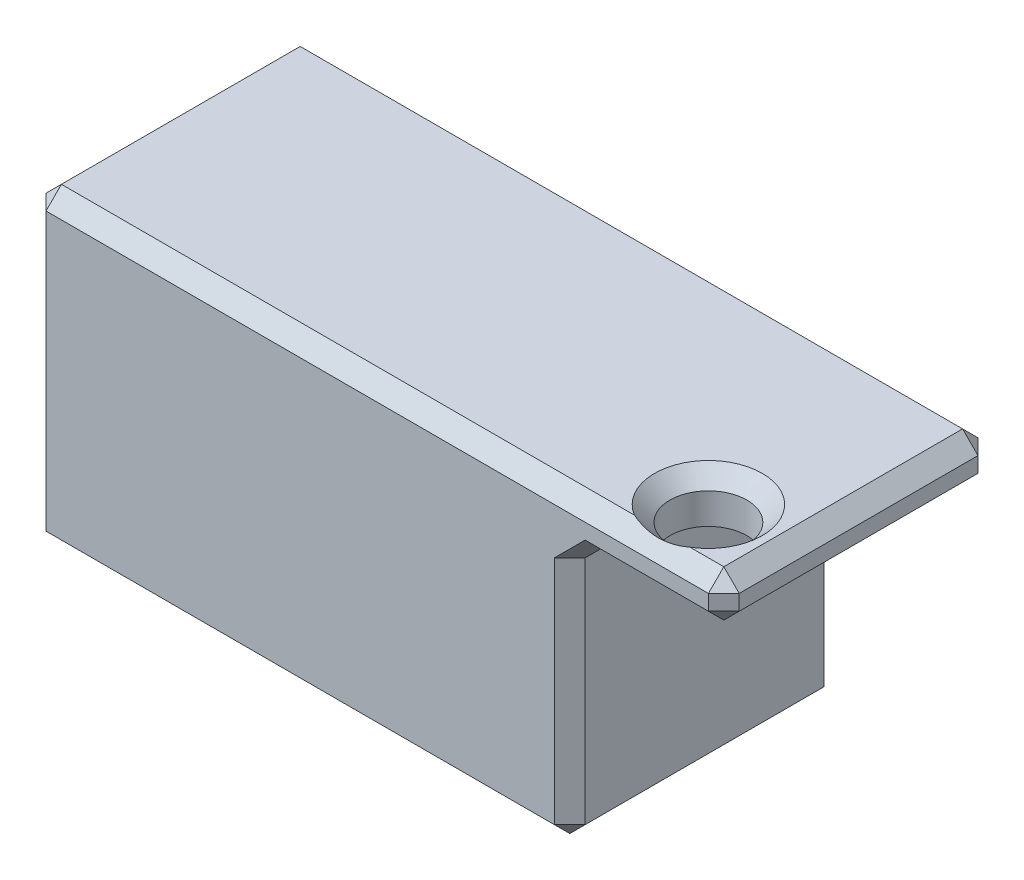
ISO-10303-21;
HEADER;
FILE_DESCRIPTION(('STEP AP214'),'2;1');
FILE_NAME('part.step','',(''),(''),'','','');
FILE_SCHEMA(('AUTOMOTIVE_DESIGN { 1 0 10303 214 1 1 1 1 }'));
ENDSEC;
DATA;
#1=APPLICATION_CONTEXT('core data for automotive mechanical design processes');
#2=APPLICATION_PROTOCOL_DEFINITION('international standard','automotive_design',2000,#1);
#3=PRODUCT_CONTEXT('',#1,'mechanical');
#4=PRODUCT('Part','Part','',(#3));
#5=PRODUCT_RELATED_PRODUCT_CATEGORY('part','',(#4));
#6=PRODUCT_DEFINITION_FORMATION('','',#4);
#7=PRODUCT_DEFINITION_CONTEXT('part definition',#1,'design');
#8=PRODUCT_DEFINITION('design','',#6,#7);
#9=PRODUCT_DEFINITION_SHAPE('','',#8);
#10=(LENGTH_UNIT() NAMED_UNIT(*) SI_UNIT(.MILLI.,.METRE.));
#11=(NAMED_UNIT(*) PLANE_ANGLE_UNIT() SI_UNIT($,.RADIAN.));
#12=(NAMED_UNIT(*) SI_UNIT($,.STERADIAN.) SOLID_ANGLE_UNIT());
#13=UNCERTAINTY_MEASURE_WITH_UNIT(LENGTH_MEASURE(1.E-05),#10,'distance_accuracy_value','');
#14=(GEOMETRIC_REPRESENTATION_CONTEXT(3) GLOBAL_UNCERTAINTY_ASSIGNED_CONTEXT((#13)) GLOBAL_UNIT_ASSIGNED_CONTEXT((#10,
#11,#12)) REPRESENTATION_CONTEXT('',''));
#15=CARTESIAN_POINT('',(0.,0.,0.));
#16=DIRECTION('',(0.,0.,1.));
#17=DIRECTION('',(1.,0.,0.));
#18=AXIS2_PLACEMENT_3D('',#15,#16,#17);
#19=CARTESIAN_POINT('',(0.,0.,-9.5));
#20=DIRECTION('',(0.,0.,-1.));
#21=DIRECTION('',(-1.,0.,0.));
#22=AXIS2_PLACEMENT_3D('',#19,#20,#21);
#23=PLANE('',#22);
#24=DIRECTION('',(0.70710678118655,0.707106781186545,0.));
#25=VECTOR('',#24,1.);
#26=CARTESIAN_POINT('',(8.99999999999988,-8.99999999999994,-9.5));
#27=LINE('',#26,#25);
#28=CARTESIAN_POINT('',(35.,17.,-9.5));
#29=VERTEX_POINT('',#28);
#30=CARTESIAN_POINT('',(36.,18.,-9.5));
#31=VERTEX_POINT('',#30);
#32=EDGE_CURVE('E188',#29,#31,#27,.T.);
#33=ORIENTED_EDGE('',*,*,#32,.F.);
#34=DIRECTION('',(0.70710678118655,0.707106781186545,0.));
#35=VECTOR('',#34,1.);
#36=CARTESIAN_POINT('',(8.99999999999988,-8.99999999999994,-9.5));
#37=LINE('',#36,#35);
#38=CARTESIAN_POINT('',(34.,16.,-9.5));
#39=VERTEX_POINT('',#38);
#40=EDGE_CURVE('E190',#39,#29,#37,.T.);
#41=ORIENTED_EDGE('',*,*,#40,.F.);
#42=DIRECTION('',(0.,-1.,0.));
#43=VECTOR('',#42,1.);
#44=CARTESIAN_POINT('',(34.,0.,-9.5));
#45=LINE('',#44,#43);
#46=CARTESIAN_POINT('',(34.,1.00000000000001,-9.5));
#47=VERTEX_POINT('',#46);
#48=EDGE_CURVE('E203',#39,#47,#45,.T.);
#49=ORIENTED_EDGE('',*,*,#48,.T.);
#50=DIRECTION('',(-1.,0.,0.));
#51=VECTOR('',#50,1.);
#52=CARTESIAN_POINT('',(0.,1.00000000000001,-9.5));
#53=LINE('',#52,#51);
#54=CARTESIAN_POINT('',(1.00000000000001,1.00000000000001,-9.5));
#55=VERTEX_POINT('',#54);
#56=EDGE_CURVE('E206',#47,#55,#53,.T.);
#57=ORIENTED_EDGE('',*,*,#56,.T.);
#58=DIRECTION('',(0.,1.,0.));
#59=VECTOR('',#58,1.);
#60=CARTESIAN_POINT('',(1.00000000000001,20.,-9.5));
#61=LINE('',#60,#59);
#62=CARTESIAN_POINT('',(1.00000000000001,19.,-9.5));
#63=VERTEX_POINT('',#62);
#64=EDGE_CURVE('E586',#55,#63,#61,.T.);
#65=ORIENTED_EDGE('',*,*,#64,.T.);
#66=DIRECTION('',(1.,0.,0.));
#67=VECTOR('',#66,1.);
#68=CARTESIAN_POINT('',(0.,19.,-9.5));
#69=LINE('',#68,#67);
#70=CARTESIAN_POINT('',(44.,19.,-9.5));
#71=VERTEX_POINT('',#70);
#72=EDGE_CURVE('E584',#63,#71,#69,.T.);
#73=ORIENTED_EDGE('',*,*,#72,.T.);
#74=DIRECTION('',(0.,-1.,0.));
#75=VECTOR('',#74,1.);
#76=CARTESIAN_POINT('',(44.,0.,-9.5));
#77=LINE('',#76,#75);
#78=CARTESIAN_POINT('',(44.,18.,-9.5));
#79=VERTEX_POINT('',#78);
#80=EDGE_CURVE('E582',#71,#79,#77,.T.);
#81=ORIENTED_EDGE('',*,*,#80,.T.);
#82=DIRECTION('',(-1.,0.,0.));
#83=VECTOR('',#82,1.);
#84=CARTESIAN_POINT('',(35.,18.,-9.5));
#85=LINE('',#84,#83);
#86=EDGE_CURVE('E193',#79,#31,#85,.T.);
#87=ORIENTED_EDGE('',*,*,#86,.T.);
#88=EDGE_LOOP('',(#33,#41,#49,#57,#65,#73,#81,#87));
#89=FACE_BOUND('',#88,.T.);
#90=ADVANCED_FACE('F43',(#89),#23,.T.);
#91=CARTESIAN_POINT('',(0.,20.,0.));
#92=DIRECTION('',(1.,0.,0.));
#93=DIRECTION('',(0.,0.,-1.));
#94=AXIS2_PLACEMENT_3D('',#91,#92,#93);
#95=PLANE('',#94);
#96=DIRECTION('',(0.,0.,-1.));
#97=VECTOR('',#96,1.);
#98=CARTESIAN_POINT('',(0.,19.,-9.5));
#99=LINE('',#98,#97);
#100=CARTESIAN_POINT('',(0.,19.,6.99999999999999));
#101=VERTEX_POINT('',#100);
#102=CARTESIAN_POINT('',(0.,19.,-8.49999999999999));
#103=VERTEX_POINT('',#102);
#104=EDGE_CURVE('E545',#101,#103,#99,.T.);
#105=ORIENTED_EDGE('',*,*,#104,.T.);
#106=DIRECTION('',(0.,-1.,0.));
#107=VECTOR('',#106,1.);
#108=CARTESIAN_POINT('',(0.,0.,-8.49999999999999));
#109=LINE('',#108,#107);
#110=CARTESIAN_POINT('',(0.,1.00000000000001,-8.49999999999999));
#111=VERTEX_POINT('',#110);
#112=EDGE_CURVE('E548',#103,#111,#109,.T.);
#113=ORIENTED_EDGE('',*,*,#112,.T.);
#114=DIRECTION('',(0.,0.,1.));
#115=VECTOR('',#114,1.);
#116=CARTESIAN_POINT('',(0.,1.00000000000001,0.));
#117=LINE('',#116,#115);
#118=CARTESIAN_POINT('',(0.,1.00000000000001,6.99999999999999));
#119=VERTEX_POINT('',#118);
#120=EDGE_CURVE('E549',#111,#119,#117,.T.);
#121=ORIENTED_EDGE('',*,*,#120,.T.);
#122=DIRECTION('',(0.,1.,0.));
#123=VECTOR('',#122,1.);
#124=CARTESIAN_POINT('',(0.,20.,6.99999999999999));
#125=LINE('',#124,#123);
#126=EDGE_CURVE('E522',#119,#101,#125,.T.);
#127=ORIENTED_EDGE('',*,*,#126,.T.);
#128=EDGE_LOOP('',(#105,#113,#121,#127));
#129=FACE_BOUND('',#128,.T.);
#130=ADVANCED_FACE('F455',(#129),#95,.F.);
#131=CARTESIAN_POINT('',(0.,20.,8.));
#132=DIRECTION('',(0.,0.,-1.));
#133=DIRECTION('',(-1.,0.,0.));
#134=AXIS2_PLACEMENT_3D('',#131,#132,#133);
#135=PLANE('',#134);
#136=DIRECTION('',(0.,1.,0.));
#137=VECTOR('',#136,1.);
#138=CARTESIAN_POINT('',(44.,20.,8.));
#139=LINE('',#138,#137);
#140=CARTESIAN_POINT('',(44.,18.,8.));
#141=VERTEX_POINT('',#140);
#142=CARTESIAN_POINT('',(44.,19.,8.));
#143=VERTEX_POINT('',#142);
#144=EDGE_CURVE('E61',#141,#143,#139,.T.);
#145=ORIENTED_EDGE('',*,*,#144,.T.);
#146=DIRECTION('',(-1.,0.,0.));
#147=VECTOR('',#146,1.);
#148=CARTESIAN_POINT('',(0.,19.,8.));
#149=LINE('',#148,#147);
#150=CARTESIAN_POINT('',(1.00000000000001,19.,8.));
#151=VERTEX_POINT('',#150);
#152=EDGE_CURVE('E53',#143,#151,#149,.T.);
#153=ORIENTED_EDGE('',*,*,#152,.T.);
#154=DIRECTION('',(0.,-1.,0.));
#155=VECTOR('',#154,1.);
#156=CARTESIAN_POINT('',(1.00000000000001,20.,8.));
#157=LINE('',#156,#155);
#158=CARTESIAN_POINT('',(1.00000000000001,1.00000000000001,8.));
#159=VERTEX_POINT('',#158);
#160=EDGE_CURVE('E222',#151,#159,#157,.T.);
#161=ORIENTED_EDGE('',*,*,#160,.T.);
#162=DIRECTION('',(1.,0.,0.));
#163=VECTOR('',#162,1.);
#164=CARTESIAN_POINT('',(0.,1.00000000000001,8.));
#165=LINE('',#164,#163);
#166=CARTESIAN_POINT('',(34.,1.00000000000001,8.));
#167=VERTEX_POINT('',#166);
#168=EDGE_CURVE('E218',#159,#167,#165,.T.);
#169=ORIENTED_EDGE('',*,*,#168,.T.);
#170=DIRECTION('',(0.,1.,0.));
#171=VECTOR('',#170,1.);
#172=CARTESIAN_POINT('',(34.,20.,8.));
#173=LINE('',#172,#171);
#174=CARTESIAN_POINT('',(34.,16.,8.));
#175=VERTEX_POINT('',#174);
#176=EDGE_CURVE('E220',#167,#175,#173,.T.);
#177=ORIENTED_EDGE('',*,*,#176,.T.);
#178=DIRECTION('',(-0.70710678118655,-0.707106781186545,0.));
#179=VECTOR('',#178,1.);
#180=CARTESIAN_POINT('',(34.,16.,8.));
#181=LINE('',#180,#179);
#182=CARTESIAN_POINT('',(35.,17.,8.));
#183=VERTEX_POINT('',#182);
#184=EDGE_CURVE('E225',#183,#175,#181,.T.);
#185=ORIENTED_EDGE('',*,*,#184,.F.);
#186=DIRECTION('',(-0.70710678118655,-0.707106781186545,0.));
#187=VECTOR('',#186,1.);
#188=CARTESIAN_POINT('',(34.,16.,8.));
#189=LINE('',#188,#187);
#190=CARTESIAN_POINT('',(36.,18.,8.));
#191=VERTEX_POINT('',#190);
#192=EDGE_CURVE('E228',#191,#183,#189,.T.);
#193=ORIENTED_EDGE('',*,*,#192,.F.);
#194=DIRECTION('',(1.,0.,0.));
#195=VECTOR('',#194,1.);
#196=CARTESIAN_POINT('',(0.,18.,8.));
#197=LINE('',#196,#195);
#198=EDGE_CURVE('E66',#191,#141,#197,.T.);
#199=ORIENTED_EDGE('',*,*,#198,.T.);
#200=EDGE_LOOP('',(#145,#153,#161,#169,#177,#185,#193,#199));
#201=FACE_BOUND('',#200,.T.);
#202=ADVANCED_FACE('F460',(#201),#135,.F.);
#203=CARTESIAN_POINT('',(35.,20.,0.));
#204=DIRECTION('',(-1.,0.,0.));
#205=DIRECTION('',(0.,0.,1.));
#206=AXIS2_PLACEMENT_3D('',#203,#204,#205);
#207=PLANE('',#206);
#208=DIRECTION('',(0.,0.,-1.));
#209=VECTOR('',#208,1.);
#210=CARTESIAN_POINT('',(35.,1.00000000000001,0.));
#211=LINE('',#210,#209);
#212=CARTESIAN_POINT('',(35.,1.00000000000001,6.99999999999999));
#213=VERTEX_POINT('',#212);
#214=CARTESIAN_POINT('',(35.,1.00000000000001,-8.49999999999999));
#215=VERTEX_POINT('',#214);
#216=EDGE_CURVE('E568',#213,#215,#211,.T.);
#217=ORIENTED_EDGE('',*,*,#216,.T.);
#218=DIRECTION('',(0.,1.,0.));
#219=VECTOR('',#218,1.);
#220=CARTESIAN_POINT('',(35.,17.,-8.49999999999999));
#221=LINE('',#220,#219);
#222=CARTESIAN_POINT('',(35.,16.,-8.49999999999999));
#223=VERTEX_POINT('',#222);
#224=EDGE_CURVE('E571',#215,#223,#221,.T.);
#225=ORIENTED_EDGE('',*,*,#224,.T.);
#226=DIRECTION('',(0.,0.,1.));
#227=VECTOR('',#226,1.);
#228=CARTESIAN_POINT('',(35.,16.,8.));
#229=LINE('',#228,#227);
#230=CARTESIAN_POINT('',(35.,16.,6.99999999999999));
#231=VERTEX_POINT('',#230);
#232=EDGE_CURVE('E566',#223,#231,#229,.T.);
#233=ORIENTED_EDGE('',*,*,#232,.T.);
#234=DIRECTION('',(0.,-1.,0.));
#235=VECTOR('',#234,1.);
#236=CARTESIAN_POINT('',(35.,20.,6.99999999999999));
#237=LINE('',#236,#235);
#238=EDGE_CURVE('E564',#231,#213,#237,.T.);
#239=ORIENTED_EDGE('',*,*,#238,.T.);
#240=EDGE_LOOP('',(#217,#225,#233,#239));
#241=FACE_BOUND('',#240,.T.);
#242=ADVANCED_FACE('F479',(#241),#207,.F.);
#243=CARTESIAN_POINT('',(0.,20.,0.));
#244=DIRECTION('',(0.,1.,0.));
#245=DIRECTION('',(0.,0.,1.));
#246=AXIS2_PLACEMENT_3D('',#243,#244,#245);
#247=PLANE('',#246);
#248=DIRECTION('',(-1.,0.,0.));
#249=VECTOR('',#248,1.);
#250=CARTESIAN_POINT('',(0.,20.,-8.49999999999999));
#251=LINE('',#250,#249);
#252=CARTESIAN_POINT('',(44.,20.,-8.49999999999999));
#253=VERTEX_POINT('',#252);
#254=CARTESIAN_POINT('',(1.00000000000001,20.,-8.49999999999999));
#255=VERTEX_POINT('',#254);
#256=EDGE_CURVE('E608',#253,#255,#251,.T.);
#257=ORIENTED_EDGE('',*,*,#256,.T.);
#258=DIRECTION('',(0.,0.,1.));
#259=VECTOR('',#258,1.);
#260=CARTESIAN_POINT('',(1.00000000000001,20.,8.));
#261=LINE('',#260,#259);
#262=CARTESIAN_POINT('',(1.00000000000001,20.,6.99999999999999));
#263=VERTEX_POINT('',#262);
#264=EDGE_CURVE('E683',#255,#263,#261,.T.);
#265=ORIENTED_EDGE('',*,*,#264,.T.);
#266=DIRECTION('',(1.,0.,0.));
#267=VECTOR('',#266,1.);
#268=CARTESIAN_POINT('',(45.,20.,6.99999999999999));
#269=LINE('',#268,#267);
#270=CARTESIAN_POINT('',(38.197224362268,20.,6.99999999999999));
#271=VERTEX_POINT('',#270);
#272=EDGE_CURVE('E540',#263,#271,#269,.T.);
#273=ORIENTED_EDGE('',*,*,#272,.T.);
#274=CARTESIAN_POINT('',(40.,20.,4.));
#275=DIRECTION('',(0.,1.,0.));
#276=DIRECTION('',(0.,0.,1.));
#277=AXIS2_PLACEMENT_3D('',#274,#275,#276);
#278=CIRCLE('',#277,3.50000000000002);
#279=CARTESIAN_POINT('',(41.8027756377321,20.,6.99999999999999));
#280=VERTEX_POINT('',#279);
#281=EDGE_CURVE('E671',#271,#280,#278,.F.);
#282=ORIENTED_EDGE('',*,*,#281,.T.);
#283=DIRECTION('',(1.,0.,0.));
#284=VECTOR('',#283,1.);
#285=CARTESIAN_POINT('',(45.,20.,6.99999999999999));
#286=LINE('',#285,#284);
#287=CARTESIAN_POINT('',(44.,20.,6.99999999999999));
#288=VERTEX_POINT('',#287);
#289=EDGE_CURVE('E675',#280,#288,#286,.T.);
#290=ORIENTED_EDGE('',*,*,#289,.T.);
#291=DIRECTION('',(0.,0.,-1.));
#292=VECTOR('',#291,1.);
#293=CARTESIAN_POINT('',(44.,20.,0.));
#294=LINE('',#293,#292);
#295=EDGE_CURVE('E680',#288,#253,#294,.T.);
#296=ORIENTED_EDGE('',*,*,#295,.T.);
#297=EDGE_LOOP('',(#257,#265,#273,#282,#290,#296));
#298=FACE_BOUND('',#297,.T.);
#299=ADVANCED_FACE('F476',(#298),#247,.T.);
#300=CARTESIAN_POINT('',(0.,0.,0.));
#301=DIRECTION('',(0.,1.,0.));
#302=DIRECTION('',(0.,0.,1.));
#303=AXIS2_PLACEMENT_3D('',#300,#301,#302);
#304=PLANE('',#303);
#305=DIRECTION('',(0.,0.,-1.));
#306=VECTOR('',#305,1.);
#307=CARTESIAN_POINT('',(1.00000000000001,0.,0.));
#308=LINE('',#307,#306);
#309=CARTESIAN_POINT('',(1.00000000000001,0.,6.99999999999999));
#310=VERTEX_POINT('',#309);
#311=CARTESIAN_POINT('',(1.00000000000001,0.,-8.49999999999999));
#312=VERTEX_POINT('',#311);
#313=EDGE_CURVE('E559',#310,#312,#308,.T.);
#314=ORIENTED_EDGE('',*,*,#313,.T.);
#315=DIRECTION('',(1.,0.,0.));
#316=VECTOR('',#315,1.);
#317=CARTESIAN_POINT('',(35.,0.,-8.49999999999999));
#318=LINE('',#317,#316);
#319=CARTESIAN_POINT('',(34.,0.,-8.49999999999999));
#320=VERTEX_POINT('',#319);
#321=EDGE_CURVE('E562',#312,#320,#318,.T.);
#322=ORIENTED_EDGE('',*,*,#321,.T.);
#323=DIRECTION('',(0.,0.,1.));
#324=VECTOR('',#323,1.);
#325=CARTESIAN_POINT('',(34.,0.,0.));
#326=LINE('',#325,#324);
#327=CARTESIAN_POINT('',(34.,0.,6.99999999999999));
#328=VERTEX_POINT('',#327);
#329=EDGE_CURVE('E557',#320,#328,#326,.T.);
#330=ORIENTED_EDGE('',*,*,#329,.T.);
#331=DIRECTION('',(-1.,0.,0.));
#332=VECTOR('',#331,1.);
#333=CARTESIAN_POINT('',(0.,0.,6.99999999999999));
#334=LINE('',#333,#332);
#335=EDGE_CURVE('E551',#328,#310,#334,.T.);
#336=ORIENTED_EDGE('',*,*,#335,.T.);
#337=EDGE_LOOP('',(#314,#322,#330,#336));
#338=FACE_BOUND('',#337,.T.);
#339=ADVANCED_FACE('F474',(#338),#304,.F.);
#340=CARTESIAN_POINT('',(45.,17.,0.));
#341=DIRECTION('',(1.,0.,0.));
#342=DIRECTION('',(0.,0.,-1.));
#343=AXIS2_PLACEMENT_3D('',#340,#341,#342);
#344=PLANE('',#343);
#345=DIRECTION('',(0.,-1.,0.));
#346=VECTOR('',#345,1.);
#347=CARTESIAN_POINT('',(45.,17.,6.99999999999999));
#348=LINE('',#347,#346);
#349=CARTESIAN_POINT('',(45.,19.,6.99999999999999));
#350=VERTEX_POINT('',#349);
#351=CARTESIAN_POINT('',(45.,18.,6.99999999999999));
#352=VERTEX_POINT('',#351);
#353=EDGE_CURVE('E196',#350,#352,#348,.T.);
#354=ORIENTED_EDGE('',*,*,#353,.T.);
#355=DIRECTION('',(0.,0.,-1.));
#356=VECTOR('',#355,1.);
#357=CARTESIAN_POINT('',(45.,18.,-9.5));
#358=LINE('',#357,#356);
#359=CARTESIAN_POINT('',(45.,18.,-8.49999999999999));
#360=VERTEX_POINT('',#359);
#361=EDGE_CURVE('E215',#352,#360,#358,.T.);
#362=ORIENTED_EDGE('',*,*,#361,.T.);
#363=DIRECTION('',(0.,1.,0.));
#364=VECTOR('',#363,1.);
#365=CARTESIAN_POINT('',(45.,17.,-8.49999999999999));
#366=LINE('',#365,#364);
#367=CARTESIAN_POINT('',(45.,19.,-8.49999999999999));
#368=VERTEX_POINT('',#367);
#369=EDGE_CURVE('E213',#360,#368,#366,.T.);
#370=ORIENTED_EDGE('',*,*,#369,.T.);
#371=DIRECTION('',(0.,0.,1.));
#372=VECTOR('',#371,1.);
#373=CARTESIAN_POINT('',(45.,19.,0.));
#374=LINE('',#373,#372);
#375=EDGE_CURVE('E211',#368,#350,#374,.T.);
#376=ORIENTED_EDGE('',*,*,#375,.T.);
#377=EDGE_LOOP('',(#354,#362,#370,#376));
#378=FACE_BOUND('',#377,.T.);
#379=ADVANCED_FACE('F470',(#378),#344,.T.);
#380=CARTESIAN_POINT('',(0.,17.,0.));
#381=DIRECTION('',(0.,1.,0.));
#382=DIRECTION('',(0.,0.,1.));
#383=AXIS2_PLACEMENT_3D('',#380,#381,#382);
#384=PLANE('',#383);
#385=DIRECTION('',(-1.,0.,0.));
#386=VECTOR('',#385,1.);
#387=CARTESIAN_POINT('',(0.,17.,6.99999999999999));
#388=LINE('',#387,#386);
#389=CARTESIAN_POINT('',(44.,17.,6.99999999999999));
#390=VERTEX_POINT('',#389);
#391=CARTESIAN_POINT('',(36.,17.,6.99999999999999));
#392=VERTEX_POINT('',#391);
#393=EDGE_CURVE('E573',#390,#392,#388,.T.);
#394=ORIENTED_EDGE('',*,*,#393,.T.);
#395=DIRECTION('',(0.,0.,-1.));
#396=VECTOR('',#395,1.);
#397=CARTESIAN_POINT('',(36.,17.,-9.5));
#398=LINE('',#397,#396);
#399=CARTESIAN_POINT('',(36.,17.,-8.49999999999999));
#400=VERTEX_POINT('',#399);
#401=EDGE_CURVE('E579',#392,#400,#398,.T.);
#402=ORIENTED_EDGE('',*,*,#401,.T.);
#403=DIRECTION('',(1.,0.,0.));
#404=VECTOR('',#403,1.);
#405=CARTESIAN_POINT('',(45.,17.,-8.49999999999999));
#406=LINE('',#405,#404);
#407=CARTESIAN_POINT('',(44.,17.,-8.49999999999999));
#408=VERTEX_POINT('',#407);
#409=EDGE_CURVE('E577',#400,#408,#406,.T.);
#410=ORIENTED_EDGE('',*,*,#409,.T.);
#411=DIRECTION('',(0.,0.,1.));
#412=VECTOR('',#411,1.);
#413=CARTESIAN_POINT('',(44.,17.,8.));
#414=LINE('',#413,#412);
#415=EDGE_CURVE('E575',#408,#390,#414,.T.);
#416=ORIENTED_EDGE('',*,*,#415,.T.);
#417=EDGE_LOOP('',(#394,#402,#410,#416));
#418=FACE_BOUND('',#417,.T.);
#419=CARTESIAN_POINT('',(40.,17.,4.));
#420=DIRECTION('',(0.,1.,0.));
#421=DIRECTION('',(0.,0.,1.));
#422=AXIS2_PLACEMENT_3D('',#419,#420,#421);
#423=CIRCLE('',#422,2.5);
#424=CARTESIAN_POINT('',(40.,17.,6.5));
#425=VERTEX_POINT('',#424);
#426=EDGE_CURVE('E668',#425,#425,#423,.T.);
#427=ORIENTED_EDGE('',*,*,#426,.T.);
#428=EDGE_LOOP('',(#427));
#429=FACE_BOUND('',#428,.T.);
#430=ADVANCED_FACE('F466',(#418,#429),#384,.F.);
#431=CARTESIAN_POINT('',(40.,17.,4.));
#432=DIRECTION('',(0.,1.,0.));
#433=DIRECTION('',(0.,0.,1.));
#434=AXIS2_PLACEMENT_3D('',#431,#432,#433);
#435=CYLINDRICAL_SURFACE('',#434,2.5);
#436=CARTESIAN_POINT('',(40.,19.,4.));
#437=DIRECTION('',(0.,1.,0.));
#438=DIRECTION('',(0.,0.,1.));
#439=AXIS2_PLACEMENT_3D('',#436,#437,#438);
#440=CIRCLE('',#439,2.5);
#441=CARTESIAN_POINT('',(40.,19.,6.5));
#442=VERTEX_POINT('',#441);
#443=EDGE_CURVE('E11',#442,#442,#440,.T.);
#444=ORIENTED_EDGE('',*,*,#443,.T.);
#445=EDGE_LOOP('',(#444));
#446=FACE_BOUND('',#445,.T.);
#447=ORIENTED_EDGE('',*,*,#426,.F.);
#448=EDGE_LOOP('',(#447));
#449=FACE_BOUND('',#448,.T.);
#450=ADVANCED_FACE('F452',(#446,#449),#435,.F.);
#451=CARTESIAN_POINT('',(35.,16.,0.));
#452=DIRECTION('',(0.707106781186545,-0.70710678118655,0.));
#453=DIRECTION('',(0.,0.,-1.));
#454=AXIS2_PLACEMENT_3D('',#451,#452,#453);
#455=PLANE('',#454);
#456=DIRECTION('',(0.70710678118655,0.707106781186545,0.));
#457=VECTOR('',#456,1.);
#458=CARTESIAN_POINT('',(35.,16.,-8.49999999999999));
#459=LINE('',#458,#457);
#460=EDGE_CURVE('E48',#400,#223,#459,.F.);
#461=ORIENTED_EDGE('',*,*,#460,.F.);
#462=ORIENTED_EDGE('',*,*,#401,.F.);
#463=DIRECTION('',(-0.70710678118655,-0.707106781186545,0.));
#464=VECTOR('',#463,1.);
#465=CARTESIAN_POINT('',(35.,16.,6.99999999999999));
#466=LINE('',#465,#464);
#467=EDGE_CURVE('E663',#231,#392,#466,.F.);
#468=ORIENTED_EDGE('',*,*,#467,.F.);
#469=ORIENTED_EDGE('',*,*,#232,.F.);
#470=EDGE_LOOP('',(#461,#462,#468,#469));
#471=FACE_BOUND('',#470,.T.);
#472=ADVANCED_FACE('F46',(#471),#455,.T.);
#473=CARTESIAN_POINT('',(36.,17.,-8.49999999999999));
#474=DIRECTION('',(0.577350269189624,-0.577350269189628,-0.577350269189624));
#475=DIRECTION('',(0.,0.707106781186545,-0.70710678118655));
#476=AXIS2_PLACEMENT_3D('',#473,#474,#475);
#477=PLANE('',#476);
#478=DIRECTION('',(0.,-0.707106781186545,0.70710678118655));
#479=VECTOR('',#478,1.);
#480=CARTESIAN_POINT('',(36.,18.,-9.5));
#481=LINE('',#480,#479);
#482=EDGE_CURVE('E661',#400,#31,#481,.F.);
#483=ORIENTED_EDGE('',*,*,#482,.F.);
#484=ORIENTED_EDGE('',*,*,#460,.T.);
#485=DIRECTION('',(-0.707106781186545,0.,-0.70710678118655));
#486=VECTOR('',#485,1.);
#487=CARTESIAN_POINT('',(35.,16.,-8.49999999999999));
#488=LINE('',#487,#486);
#489=EDGE_CURVE('E201',#39,#223,#488,.F.);
#490=ORIENTED_EDGE('',*,*,#489,.F.);
#491=ORIENTED_EDGE('',*,*,#40,.T.);
#492=ORIENTED_EDGE('',*,*,#32,.T.);
#493=EDGE_LOOP('',(#483,#484,#490,#491,#492));
#494=FACE_BOUND('',#493,.T.);
#495=ADVANCED_FACE('F198',(#494),#477,.T.);
#496=CARTESIAN_POINT('',(35.,16.,6.99999999999999));
#497=DIRECTION('',(0.577350269189626,-0.57735026918963,0.577350269189622));
#498=DIRECTION('',(0.70710678118655,0.707106781186545,0.));
#499=AXIS2_PLACEMENT_3D('',#496,#497,#498);
#500=PLANE('',#499);
#501=DIRECTION('',(0.707106781186545,0.,-0.70710678118655));
#502=VECTOR('',#501,1.);
#503=CARTESIAN_POINT('',(34.,16.,8.));
#504=LINE('',#503,#502);
#505=EDGE_CURVE('E655',#231,#175,#504,.F.);
#506=ORIENTED_EDGE('',*,*,#505,.F.);
#507=ORIENTED_EDGE('',*,*,#467,.T.);
#508=DIRECTION('',(0.,0.707106781186545,0.70710678118655));
#509=VECTOR('',#508,1.);
#510=CARTESIAN_POINT('',(36.,17.,6.99999999999999));
#511=LINE('',#510,#509);
#512=EDGE_CURVE('E658',#191,#392,#511,.F.);
#513=ORIENTED_EDGE('',*,*,#512,.F.);
#514=ORIENTED_EDGE('',*,*,#192,.T.);
#515=ORIENTED_EDGE('',*,*,#184,.T.);
#516=EDGE_LOOP('',(#506,#507,#513,#514,#515));
#517=FACE_BOUND('',#516,.T.);
#518=ADVANCED_FACE('F439',(#517),#500,.T.);
#519=CARTESIAN_POINT('',(34.,0.,-9.5));
#520=DIRECTION('',(0.70710678118655,0.,-0.707106781186545));
#521=DIRECTION('',(0.,1.,0.));
#522=AXIS2_PLACEMENT_3D('',#519,#520,#521);
#523=PLANE('',#522);
#524=ORIENTED_EDGE('',*,*,#489,.T.);
#525=ORIENTED_EDGE('',*,*,#224,.F.);
#526=DIRECTION('',(0.707106781186545,0.,0.70710678118655));
#527=VECTOR('',#526,1.);
#528=CARTESIAN_POINT('',(35.,1.00000000000001,-8.49999999999999));
#529=LINE('',#528,#527);
#530=EDGE_CURVE('E650',#47,#215,#529,.T.);
#531=ORIENTED_EDGE('',*,*,#530,.F.);
#532=ORIENTED_EDGE('',*,*,#48,.F.);
#533=EDGE_LOOP('',(#524,#525,#531,#532));
#534=FACE_BOUND('',#533,.T.);
#535=ADVANCED_FACE('F432',(#534),#523,.T.);
#536=CARTESIAN_POINT('',(0.,18.,-9.5));
#537=DIRECTION('',(0.,-0.70710678118655,-0.707106781186545));
#538=DIRECTION('',(1.,0.,0.));
#539=AXIS2_PLACEMENT_3D('',#536,#537,#538);
#540=PLANE('',#539);
#541=ORIENTED_EDGE('',*,*,#482,.T.);
#542=ORIENTED_EDGE('',*,*,#86,.F.);
#543=DIRECTION('',(0.,0.707106781186545,-0.70710678118655));
#544=VECTOR('',#543,1.);
#545=CARTESIAN_POINT('',(44.,17.,-8.49999999999999));
#546=LINE('',#545,#544);
#547=EDGE_CURVE('E647',#408,#79,#546,.T.);
#548=ORIENTED_EDGE('',*,*,#547,.F.);
#549=ORIENTED_EDGE('',*,*,#409,.F.);
#550=EDGE_LOOP('',(#541,#542,#548,#549));
#551=FACE_BOUND('',#550,.T.);
#552=ADVANCED_FACE('F425',(#551),#540,.T.);
#553=CARTESIAN_POINT('',(45.,18.,0.));
#554=DIRECTION('',(0.707106781186545,-0.70710678118655,0.));
#555=DIRECTION('',(0.,0.,1.));
#556=AXIS2_PLACEMENT_3D('',#553,#554,#555);
#557=PLANE('',#556);
#558=DIRECTION('',(0.70710678118655,0.707106781186545,0.));
#559=VECTOR('',#558,1.);
#560=CARTESIAN_POINT('',(44.,17.,6.99999999999999));
#561=LINE('',#560,#559);
#562=EDGE_CURVE('E641',#390,#352,#561,.T.);
#563=ORIENTED_EDGE('',*,*,#562,.F.);
#564=ORIENTED_EDGE('',*,*,#415,.F.);
#565=DIRECTION('',(-0.70710678118655,-0.707106781186545,0.));
#566=VECTOR('',#565,1.);
#567=CARTESIAN_POINT('',(44.,17.,-8.49999999999999));
#568=LINE('',#567,#566);
#569=EDGE_CURVE('E644',#360,#408,#568,.T.);
#570=ORIENTED_EDGE('',*,*,#569,.F.);
#571=ORIENTED_EDGE('',*,*,#361,.F.);
#572=EDGE_LOOP('',(#563,#564,#570,#571));
#573=FACE_BOUND('',#572,.T.);
#574=ADVANCED_FACE('F418',(#573),#557,.T.);
#575=CARTESIAN_POINT('',(0.,18.,8.));
#576=DIRECTION('',(0.,0.70710678118655,-0.707106781186545));
#577=DIRECTION('',(1.,0.,0.));
#578=AXIS2_PLACEMENT_3D('',#575,#576,#577);
#579=PLANE('',#578);
#580=ORIENTED_EDGE('',*,*,#512,.T.);
#581=ORIENTED_EDGE('',*,*,#393,.F.);
#582=DIRECTION('',(0.,0.707106781186545,0.70710678118655));
#583=VECTOR('',#582,1.);
#584=CARTESIAN_POINT('',(44.,17.,6.99999999999999));
#585=LINE('',#584,#583);
#586=EDGE_CURVE('E638',#141,#390,#585,.F.);
#587=ORIENTED_EDGE('',*,*,#586,.F.);
#588=ORIENTED_EDGE('',*,*,#198,.F.);
#589=EDGE_LOOP('',(#580,#581,#587,#588));
#590=FACE_BOUND('',#589,.T.);
#591=ADVANCED_FACE('F411',(#590),#579,.F.);
#592=CARTESIAN_POINT('',(35.,20.,6.99999999999999));
#593=DIRECTION('',(-0.70710678118655,0.,-0.707106781186545));
#594=DIRECTION('',(0.,-1.,0.));
#595=AXIS2_PLACEMENT_3D('',#592,#593,#594);
#596=PLANE('',#595);
#597=ORIENTED_EDGE('',*,*,#505,.T.);
#598=ORIENTED_EDGE('',*,*,#176,.F.);
#599=DIRECTION('',(0.707106781186545,0.,-0.70710678118655));
#600=VECTOR('',#599,1.);
#601=CARTESIAN_POINT('',(34.5,1.00000000000001,7.49999999999999));
#602=LINE('',#601,#600);
#603=EDGE_CURVE('E635',#213,#167,#602,.F.);
#604=ORIENTED_EDGE('',*,*,#603,.F.);
#605=ORIENTED_EDGE('',*,*,#238,.F.);
#606=EDGE_LOOP('',(#597,#598,#604,#605));
#607=FACE_BOUND('',#606,.T.);
#608=ADVANCED_FACE('F404',(#607),#596,.F.);
#609=CARTESIAN_POINT('',(35.,1.00000000000001,0.));
#610=DIRECTION('',(-0.707106781186545,0.70710678118655,0.));
#611=DIRECTION('',(0.,0.,-1.));
#612=AXIS2_PLACEMENT_3D('',#609,#610,#611);
#613=PLANE('',#612);
#614=DIRECTION('',(0.70710678118655,0.707106781186545,0.));
#615=VECTOR('',#614,1.);
#616=CARTESIAN_POINT('',(35.,1.00000000000001,-8.49999999999999));
#617=LINE('',#616,#615);
#618=EDGE_CURVE('E652',#215,#320,#617,.F.);
#619=ORIENTED_EDGE('',*,*,#618,.F.);
#620=ORIENTED_EDGE('',*,*,#216,.F.);
#621=DIRECTION('',(-0.70710678118655,-0.707106781186545,0.));
#622=VECTOR('',#621,1.);
#623=CARTESIAN_POINT('',(34.,0.,6.99999999999999));
#624=LINE('',#623,#622);
#625=EDGE_CURVE('E632',#328,#213,#624,.F.);
#626=ORIENTED_EDGE('',*,*,#625,.F.);
#627=ORIENTED_EDGE('',*,*,#329,.F.);
#628=EDGE_LOOP('',(#619,#620,#626,#627));
#629=FACE_BOUND('',#628,.T.);
#630=ADVANCED_FACE('F397',(#629),#613,.F.);
#631=CARTESIAN_POINT('',(35.,1.00000000000001,-8.49999999999999));
#632=DIRECTION('',(0.577350269189626,-0.57735026918963,-0.577350269189622));
#633=DIRECTION('',(0.70710678118655,0.707106781186545,0.));
#634=AXIS2_PLACEMENT_3D('',#631,#632,#633);
#635=PLANE('',#634);
#636=ORIENTED_EDGE('',*,*,#530,.T.);
#637=ORIENTED_EDGE('',*,*,#618,.T.);
#638=DIRECTION('',(0.,0.707106781186545,-0.70710678118655));
#639=VECTOR('',#638,1.);
#640=CARTESIAN_POINT('',(34.,0.500000000000004,-8.99999999999999));
#641=LINE('',#640,#639);
#642=EDGE_CURVE('E630',#47,#320,#641,.F.);
#643=ORIENTED_EDGE('',*,*,#642,.F.);
#644=EDGE_LOOP('',(#636,#637,#643));
#645=FACE_BOUND('',#644,.T.);
#646=ADVANCED_FACE('F390',(#645),#635,.T.);
#647=CARTESIAN_POINT('',(44.,17.,-8.49999999999999));
#648=DIRECTION('',(0.577350269189626,-0.57735026918963,-0.577350269189622));
#649=DIRECTION('',(0.70710678118655,0.707106781186545,0.));
#650=AXIS2_PLACEMENT_3D('',#647,#648,#649);
#651=PLANE('',#650);
#652=ORIENTED_EDGE('',*,*,#569,.T.);
#653=ORIENTED_EDGE('',*,*,#547,.T.);
#654=DIRECTION('',(-0.707106781186545,0.,-0.70710678118655));
#655=VECTOR('',#654,1.);
#656=CARTESIAN_POINT('',(44.5,18.,-8.99999999999999));
#657=LINE('',#656,#655);
#658=EDGE_CURVE('E616',#360,#79,#657,.T.);
#659=ORIENTED_EDGE('',*,*,#658,.F.);
#660=EDGE_LOOP('',(#652,#653,#659));
#661=FACE_BOUND('',#660,.T.);
#662=ADVANCED_FACE('F383',(#661),#651,.T.);
#663=CARTESIAN_POINT('',(44.,17.,6.99999999999999));
#664=DIRECTION('',(0.577350269189626,-0.57735026918963,0.577350269189622));
#665=DIRECTION('',(0.70710678118655,0.707106781186545,0.));
#666=AXIS2_PLACEMENT_3D('',#663,#664,#665);
#667=PLANE('',#666);
#668=ORIENTED_EDGE('',*,*,#586,.T.);
#669=ORIENTED_EDGE('',*,*,#562,.T.);
#670=DIRECTION('',(-0.707106781186545,0.,0.70710678118655));
#671=VECTOR('',#670,1.);
#672=CARTESIAN_POINT('',(44.5,18.,7.49999999999999));
#673=LINE('',#672,#671);
#674=EDGE_CURVE('E626',#141,#352,#673,.F.);
#675=ORIENTED_EDGE('',*,*,#674,.F.);
#676=EDGE_LOOP('',(#668,#669,#675));
#677=FACE_BOUND('',#676,.T.);
#678=ADVANCED_FACE('F376',(#677),#667,.T.);
#679=CARTESIAN_POINT('',(34.,0.,6.99999999999999));
#680=DIRECTION('',(0.577350269189626,-0.57735026918963,0.577350269189622));
#681=DIRECTION('',(0.70710678118655,0.707106781186545,0.));
#682=AXIS2_PLACEMENT_3D('',#679,#680,#681);
#683=PLANE('',#682);
#684=ORIENTED_EDGE('',*,*,#625,.T.);
#685=ORIENTED_EDGE('',*,*,#603,.T.);
#686=DIRECTION('',(0.,0.707106781186545,0.70710678118655));
#687=VECTOR('',#686,1.);
#688=CARTESIAN_POINT('',(34.,0.,6.99999999999999));
#689=LINE('',#688,#687);
#690=EDGE_CURVE('E534',#328,#167,#689,.T.);
#691=ORIENTED_EDGE('',*,*,#690,.F.);
#692=EDGE_LOOP('',(#684,#685,#691));
#693=FACE_BOUND('',#692,.T.);
#694=ADVANCED_FACE('F369',(#693),#683,.T.);
#695=CARTESIAN_POINT('',(0.,1.00000000000001,-9.5));
#696=DIRECTION('',(0.,-0.70710678118655,-0.707106781186545));
#697=DIRECTION('',(1.,0.,0.));
#698=AXIS2_PLACEMENT_3D('',#695,#696,#697);
#699=PLANE('',#698);
#700=ORIENTED_EDGE('',*,*,#642,.T.);
#701=ORIENTED_EDGE('',*,*,#321,.F.);
#702=DIRECTION('',(0.,-0.707106781186545,0.70710678118655));
#703=VECTOR('',#702,1.);
#704=CARTESIAN_POINT('',(1.00000000000001,0.,-8.49999999999999));
#705=LINE('',#704,#703);
#706=EDGE_CURVE('E594',#55,#312,#705,.T.);
#707=ORIENTED_EDGE('',*,*,#706,.F.);
#708=ORIENTED_EDGE('',*,*,#56,.F.);
#709=EDGE_LOOP('',(#700,#701,#707,#708));
#710=FACE_BOUND('',#709,.T.);
#711=ADVANCED_FACE('F362',(#710),#699,.T.);
#712=CARTESIAN_POINT('',(44.,0.,-9.5));
#713=DIRECTION('',(-0.70710678118655,0.,0.707106781186545));
#714=DIRECTION('',(0.,-1.,0.));
#715=AXIS2_PLACEMENT_3D('',#712,#713,#714);
#716=PLANE('',#715);
#717=ORIENTED_EDGE('',*,*,#658,.T.);
#718=ORIENTED_EDGE('',*,*,#80,.F.);
#719=DIRECTION('',(0.707106781186545,0.,0.70710678118655));
#720=VECTOR('',#719,1.);
#721=CARTESIAN_POINT('',(44.,19.,-9.5));
#722=LINE('',#721,#720);
#723=EDGE_CURVE('E599',#368,#71,#722,.F.);
#724=ORIENTED_EDGE('',*,*,#723,.F.);
#725=ORIENTED_EDGE('',*,*,#369,.F.);
#726=EDGE_LOOP('',(#717,#718,#724,#725));
#727=FACE_BOUND('',#726,.T.);
#728=ADVANCED_FACE('F355',(#727),#716,.F.);
#729=CARTESIAN_POINT('',(44.,20.,0.));
#730=DIRECTION('',(-0.70710678118655,-0.707106781186545,0.));
#731=DIRECTION('',(0.,0.,-1.));
#732=AXIS2_PLACEMENT_3D('',#729,#730,#731);
#733=PLANE('',#732);
#734=DIRECTION('',(0.707106781186545,-0.70710678118655,0.));
#735=VECTOR('',#734,1.);
#736=CARTESIAN_POINT('',(45.,19.,6.99999999999999));
#737=LINE('',#736,#735);
#738=EDGE_CURVE('E620',#350,#288,#737,.F.);
#739=ORIENTED_EDGE('',*,*,#738,.F.);
#740=ORIENTED_EDGE('',*,*,#375,.F.);
#741=DIRECTION('',(-0.707106781186545,0.70710678118655,0.));
#742=VECTOR('',#741,1.);
#743=CARTESIAN_POINT('',(44.5,19.5,-8.49999999999999));
#744=LINE('',#743,#742);
#745=EDGE_CURVE('E618',#253,#368,#744,.F.);
#746=ORIENTED_EDGE('',*,*,#745,.F.);
#747=ORIENTED_EDGE('',*,*,#295,.F.);
#748=EDGE_LOOP('',(#739,#740,#746,#747));
#749=FACE_BOUND('',#748,.T.);
#750=ADVANCED_FACE('F348',(#749),#733,.F.);
#751=CARTESIAN_POINT('',(44.,20.,8.));
#752=DIRECTION('',(0.70710678118655,0.,0.707106781186545));
#753=DIRECTION('',(0.,-1.,0.));
#754=AXIS2_PLACEMENT_3D('',#751,#752,#753);
#755=PLANE('',#754);
#756=ORIENTED_EDGE('',*,*,#674,.T.);
#757=ORIENTED_EDGE('',*,*,#353,.F.);
#758=DIRECTION('',(0.707106781186545,0.,-0.70710678118655));
#759=VECTOR('',#758,1.);
#760=CARTESIAN_POINT('',(45.,19.,6.99999999999999));
#761=LINE('',#760,#759);
#762=EDGE_CURVE('E530',#143,#350,#761,.T.);
#763=ORIENTED_EDGE('',*,*,#762,.F.);
#764=ORIENTED_EDGE('',*,*,#144,.F.);
#765=EDGE_LOOP('',(#756,#757,#763,#764));
#766=FACE_BOUND('',#765,.T.);
#767=ADVANCED_FACE('F341',(#766),#755,.T.);
#768=CARTESIAN_POINT('',(0.,1.00000000000001,8.));
#769=DIRECTION('',(0.,0.70710678118655,-0.707106781186545));
#770=DIRECTION('',(1.,0.,0.));
#771=AXIS2_PLACEMENT_3D('',#768,#769,#770);
#772=PLANE('',#771);
#773=ORIENTED_EDGE('',*,*,#690,.T.);
#774=ORIENTED_EDGE('',*,*,#168,.F.);
#775=DIRECTION('',(0.,-0.707106781186545,-0.70710678118655));
#776=VECTOR('',#775,1.);
#777=CARTESIAN_POINT('',(1.00000000000001,0.500000000000004,7.49999999999999));
#778=LINE('',#777,#776);
#779=EDGE_CURVE('E525',#310,#159,#778,.F.);
#780=ORIENTED_EDGE('',*,*,#779,.F.);
#781=ORIENTED_EDGE('',*,*,#335,.F.);
#782=EDGE_LOOP('',(#773,#774,#780,#781));
#783=FACE_BOUND('',#782,.T.);
#784=ADVANCED_FACE('F334',(#783),#772,.F.);
#785=CARTESIAN_POINT('',(0.,1.00000000000001,0.));
#786=DIRECTION('',(0.707106781186545,0.70710678118655,0.));
#787=DIRECTION('',(0.,0.,1.));
#788=AXIS2_PLACEMENT_3D('',#785,#786,#787);
#789=PLANE('',#788);
#790=DIRECTION('',(0.70710678118655,-0.707106781186545,0.));
#791=VECTOR('',#790,1.);
#792=CARTESIAN_POINT('',(1.00000000000001,0.,-8.49999999999999));
#793=LINE('',#792,#791);
#794=EDGE_CURVE('E598',#312,#111,#793,.F.);
#795=ORIENTED_EDGE('',*,*,#794,.F.);
#796=ORIENTED_EDGE('',*,*,#313,.F.);
#797=DIRECTION('',(-0.70710678118655,0.707106781186545,0.));
#798=VECTOR('',#797,1.);
#799=CARTESIAN_POINT('',(0.,1.00000000000001,6.99999999999999));
#800=LINE('',#799,#798);
#801=EDGE_CURVE('E528',#119,#310,#800,.F.);
#802=ORIENTED_EDGE('',*,*,#801,.F.);
#803=ORIENTED_EDGE('',*,*,#120,.F.);
#804=EDGE_LOOP('',(#795,#796,#802,#803));
#805=FACE_BOUND('',#804,.T.);
#806=ADVANCED_FACE('F327',(#805),#789,.F.);
#807=CARTESIAN_POINT('',(1.00000000000001,0.,-8.49999999999999));
#808=DIRECTION('',(-0.577350269189626,-0.57735026918963,-0.577350269189622));
#809=DIRECTION('',(0.70710678118655,-0.707106781186545,0.));
#810=AXIS2_PLACEMENT_3D('',#807,#808,#809);
#811=PLANE('',#810);
#812=ORIENTED_EDGE('',*,*,#706,.T.);
#813=ORIENTED_EDGE('',*,*,#794,.T.);
#814=DIRECTION('',(0.707106781186545,0.,-0.70710678118655));
#815=VECTOR('',#814,1.);
#816=CARTESIAN_POINT('',(0.500000000000004,1.00000000000001,-8.99999999999999));
#817=LINE('',#816,#815);
#818=EDGE_CURVE('E602',#55,#111,#817,.F.);
#819=ORIENTED_EDGE('',*,*,#818,.F.);
#820=EDGE_LOOP('',(#812,#813,#819));
#821=FACE_BOUND('',#820,.T.);
#822=ADVANCED_FACE('F320',(#821),#811,.T.);
#823=CARTESIAN_POINT('',(44.,19.,-9.5));
#824=DIRECTION('',(0.57735026918963,0.577350269189626,-0.577350269189622));
#825=DIRECTION('',(-0.707106781186545,0.70710678118655,0.));
#826=AXIS2_PLACEMENT_3D('',#823,#824,#825);
#827=PLANE('',#826);
#828=ORIENTED_EDGE('',*,*,#745,.T.);
#829=ORIENTED_EDGE('',*,*,#723,.T.);
#830=DIRECTION('',(0.,-0.707106781186545,-0.70710678118655));
#831=VECTOR('',#830,1.);
#832=CARTESIAN_POINT('',(44.,19.,-9.5));
#833=LINE('',#832,#831);
#834=EDGE_CURVE('E264',#253,#71,#833,.T.);
#835=ORIENTED_EDGE('',*,*,#834,.F.);
#836=EDGE_LOOP('',(#828,#829,#835));
#837=FACE_BOUND('',#836,.T.);
#838=ADVANCED_FACE('F278',(#837),#827,.T.);
#839=CARTESIAN_POINT('',(40.,19.,4.));
#840=DIRECTION('',(0.,1.,0.));
#841=DIRECTION('',(0.,0.,1.));
#842=AXIS2_PLACEMENT_3D('',#839,#840,#841);
#843=CONICAL_SURFACE('',#842,2.5,0.785398163397452);
#844=ORIENTED_EDGE('',*,*,#443,.F.);
#845=EDGE_LOOP('',(#844));
#846=FACE_BOUND('',#845,.T.);
#847=CARTESIAN_POINT('',(41.8034966038228,20.0002,6.99979999999999));
#848=CARTESIAN_POINT('',(41.6675606455762,19.9624503201097,7.03754967989028));
#849=CARTESIAN_POINT('',(41.5294681232495,19.9284309067715,7.07156909322851));
#850=CARTESIAN_POINT('',(41.2496136233681,19.868618923028,7.13138107697203));
#851=CARTESIAN_POINT('',(41.1078478366026,19.8428352951954,7.15716470480456));
#852=CARTESIAN_POINT('',(40.8219959889826,19.8004069018309,7.19959309816907));
#853=CARTESIAN_POINT('',(40.6779176910924,19.7837363037326,7.21626369626741));
#854=CARTESIAN_POINT('',(40.3882490603619,19.7599833702554,7.24001662974455));
#855=CARTESIAN_POINT('',(40.2426595191883,19.7528962470533,7.24710375294673));
#856=CARTESIAN_POINT('',(39.9568186874981,19.7486329972092,7.25136700279075));
#857=CARTESIAN_POINT('',(39.8165783428847,19.751084739073,7.24891526092703));
#858=CARTESIAN_POINT('',(39.536962409172,19.7649887054765,7.23501129452351));
#859=CARTESIAN_POINT('',(39.3975870436577,19.7764431668047,7.2235568331953));
#860=CARTESIAN_POINT('',(39.121078313338,19.8079549983296,7.19204500167035));
#861=CARTESIAN_POINT('',(38.9839413191658,19.8279966204778,7.17200337952215));
#862=CARTESIAN_POINT('',(38.7125728489649,19.8760821092629,7.12391789073713));
#863=CARTESIAN_POINT('',(38.5783400119308,19.9041221361242,7.09587786387581));
#864=CARTESIAN_POINT('',(38.403940910283,19.9458185051603,7.05418149483964));
#865=CARTESIAN_POINT('',(38.3621683918318,19.956212359945,7.04378764005502));
#866=CARTESIAN_POINT('',(38.2790372476634,19.977691468862,7.02230853113796));
#867=CARTESIAN_POINT('',(38.2376781843481,19.9887758758817,7.01122412411824));
#868=CARTESIAN_POINT('',(38.1965033961773,20.0002,6.99979999999999));
#869=B_SPLINE_CURVE_WITH_KNOTS('',3,(#847,#848,#849,#850,#851,#852,#853,#854,#855,#856,#857,
#858,#859,#860,#861,#862,#863,#864,#865,#866,#867,#868),.UNSPECIFIED.,.F.,.F.,(4,2,2,2,2,2,2,2,
2,2,4),(0.,0.4381389880678,0.876752111212406,1.3141153705439,1.75126004604613,2.17152502878917,
2.59189446231813,3.01149625532785,3.43089694912253,3.56373864146364,3.69642046642997),.UNSPECIFIED.);
#870=EDGE_CURVE('E255',#280,#271,#869,.T.);
#871=ORIENTED_EDGE('',*,*,#870,.F.);
#872=ORIENTED_EDGE('',*,*,#281,.F.);
#873=EDGE_LOOP('',(#871,#872));
#874=FACE_BOUND('',#873,.T.);
#875=ADVANCED_FACE('F270',(#846,#874),#843,.F.);
#876=CARTESIAN_POINT('',(45.,19.,6.99999999999999));
#877=DIRECTION('',(0.57735026918963,0.577350269189626,0.577350269189622));
#878=DIRECTION('',(-0.707106781186545,0.70710678118655,0.));
#879=AXIS2_PLACEMENT_3D('',#876,#877,#878);
#880=PLANE('',#879);
#881=ORIENTED_EDGE('',*,*,#762,.T.);
#882=ORIENTED_EDGE('',*,*,#738,.T.);
#883=DIRECTION('',(0.,-0.707106781186545,0.70710678118655));
#884=VECTOR('',#883,1.);
#885=CARTESIAN_POINT('',(44.,19.5,7.49999999999999));
#886=LINE('',#885,#884);
#887=EDGE_CURVE('E252',#143,#288,#886,.F.);
#888=ORIENTED_EDGE('',*,*,#887,.F.);
#889=EDGE_LOOP('',(#881,#882,#888));
#890=FACE_BOUND('',#889,.T.);
#891=ADVANCED_FACE('F277',(#890),#880,.T.);
#892=CARTESIAN_POINT('',(0.,1.00000000000001,6.99999999999999));
#893=DIRECTION('',(-0.577350269189626,-0.57735026918963,0.577350269189622));
#894=DIRECTION('',(0.70710678118655,-0.707106781186545,0.));
#895=AXIS2_PLACEMENT_3D('',#892,#893,#894);
#896=PLANE('',#895);
#897=ORIENTED_EDGE('',*,*,#801,.T.);
#898=ORIENTED_EDGE('',*,*,#779,.T.);
#899=DIRECTION('',(0.707106781186545,0.,0.70710678118655));
#900=VECTOR('',#899,1.);
#901=CARTESIAN_POINT('',(0.,1.00000000000001,6.99999999999999));
#902=LINE('',#901,#900);
#903=EDGE_CURVE('E250',#119,#159,#902,.T.);
#904=ORIENTED_EDGE('',*,*,#903,.F.);
#905=EDGE_LOOP('',(#897,#898,#904));
#906=FACE_BOUND('',#905,.T.);
#907=ADVANCED_FACE('F301',(#906),#896,.T.);
#908=CARTESIAN_POINT('',(1.00000000000001,0.,-9.5));
#909=DIRECTION('',(-0.70710678118655,0.,-0.707106781186545));
#910=DIRECTION('',(0.,-1.,0.));
#911=AXIS2_PLACEMENT_3D('',#908,#909,#910);
#912=PLANE('',#911);
#913=ORIENTED_EDGE('',*,*,#818,.T.);
#914=ORIENTED_EDGE('',*,*,#112,.F.);
#915=DIRECTION('',(-0.707106781186545,0.,0.70710678118655));
#916=VECTOR('',#915,1.);
#917=CARTESIAN_POINT('',(0.,19.,-8.49999999999999));
#918=LINE('',#917,#916);
#919=EDGE_CURVE('E247',#63,#103,#918,.T.);
#920=ORIENTED_EDGE('',*,*,#919,.F.);
#921=ORIENTED_EDGE('',*,*,#64,.F.);
#922=EDGE_LOOP('',(#913,#914,#920,#921));
#923=FACE_BOUND('',#922,.T.);
#924=ADVANCED_FACE('F294',(#923),#912,.T.);
#925=CARTESIAN_POINT('',(0.,19.,-9.5));
#926=DIRECTION('',(0.,-0.70710678118655,0.707106781186545));
#927=DIRECTION('',(1.,0.,0.));
#928=AXIS2_PLACEMENT_3D('',#925,#926,#927);
#929=PLANE('',#928);
#930=ORIENTED_EDGE('',*,*,#834,.T.);
#931=ORIENTED_EDGE('',*,*,#72,.F.);
#932=DIRECTION('',(0.,0.707106781186545,0.70710678118655));
#933=VECTOR('',#932,1.);
#934=CARTESIAN_POINT('',(1.00000000000001,19.5,-8.99999999999999));
#935=LINE('',#934,#933);
#936=EDGE_CURVE('E244',#255,#63,#935,.F.);
#937=ORIENTED_EDGE('',*,*,#936,.F.);
#938=ORIENTED_EDGE('',*,*,#256,.F.);
#939=EDGE_LOOP('',(#930,#931,#937,#938));
#940=FACE_BOUND('',#939,.T.);
#941=ADVANCED_FACE('F287',(#940),#929,.F.);
#942=CARTESIAN_POINT('',(0.,20.,6.99999999999999));
#943=DIRECTION('',(0.,0.70710678118655,0.707106781186545));
#944=DIRECTION('',(-1.,0.,0.));
#945=AXIS2_PLACEMENT_3D('',#942,#943,#944);
#946=PLANE('',#945);
#947=ORIENTED_EDGE('',*,*,#870,.T.);
#948=ORIENTED_EDGE('',*,*,#272,.F.);
#949=DIRECTION('',(0.,0.707106781186545,-0.70710678118655));
#950=VECTOR('',#949,1.);
#951=CARTESIAN_POINT('',(1.00000000000001,20.,6.99999999999999));
#952=LINE('',#951,#950);
#953=EDGE_CURVE('E241',#151,#263,#952,.T.);
#954=ORIENTED_EDGE('',*,*,#953,.F.);
#955=ORIENTED_EDGE('',*,*,#152,.F.);
#956=ORIENTED_EDGE('',*,*,#887,.T.);
#957=ORIENTED_EDGE('',*,*,#289,.F.);
#958=EDGE_LOOP('',(#947,#948,#954,#955,#956,#957));
#959=FACE_BOUND('',#958,.T.);
#960=ADVANCED_FACE('F280',(#959),#946,.T.);
#961=CARTESIAN_POINT('',(1.00000000000001,20.,8.));
#962=DIRECTION('',(0.70710678118655,0.,-0.707106781186545));
#963=DIRECTION('',(0.,-1.,0.));
#964=AXIS2_PLACEMENT_3D('',#961,#962,#963);
#965=PLANE('',#964);
#966=ORIENTED_EDGE('',*,*,#903,.T.);
#967=ORIENTED_EDGE('',*,*,#160,.F.);
#968=DIRECTION('',(-0.707106781186545,0.,-0.70710678118655));
#969=VECTOR('',#968,1.);
#970=CARTESIAN_POINT('',(0.500000000000004,19.,7.49999999999999));
#971=LINE('',#970,#969);
#972=EDGE_CURVE('E238',#101,#151,#971,.F.);
#973=ORIENTED_EDGE('',*,*,#972,.F.);
#974=ORIENTED_EDGE('',*,*,#126,.F.);
#975=EDGE_LOOP('',(#966,#967,#973,#974));
#976=FACE_BOUND('',#975,.T.);
#977=ADVANCED_FACE('F286',(#976),#965,.F.);
#978=CARTESIAN_POINT('',(0.,19.,-8.49999999999999));
#979=DIRECTION('',(-0.57735026918963,0.577350269189626,-0.577350269189622));
#980=DIRECTION('',(-0.707106781186545,-0.70710678118655,0.));
#981=AXIS2_PLACEMENT_3D('',#978,#979,#980);
#982=PLANE('',#981);
#983=ORIENTED_EDGE('',*,*,#936,.T.);
#984=ORIENTED_EDGE('',*,*,#919,.T.);
#985=DIRECTION('',(0.707106781186545,0.70710678118655,0.));
#986=VECTOR('',#985,1.);
#987=CARTESIAN_POINT('',(0.,19.,-8.49999999999999));
#988=LINE('',#987,#986);
#989=EDGE_CURVE('E236',#255,#103,#988,.F.);
#990=ORIENTED_EDGE('',*,*,#989,.F.);
#991=EDGE_LOOP('',(#983,#984,#990));
#992=FACE_BOUND('',#991,.T.);
#993=ADVANCED_FACE('F503',(#992),#982,.T.);
#994=CARTESIAN_POINT('',(1.00000000000001,20.,6.99999999999999));
#995=DIRECTION('',(-0.57735026918963,0.577350269189626,0.577350269189622));
#996=DIRECTION('',(-0.707106781186545,-0.70710678118655,0.));
#997=AXIS2_PLACEMENT_3D('',#994,#995,#996);
#998=PLANE('',#997);
#999=ORIENTED_EDGE('',*,*,#972,.T.);
#1000=ORIENTED_EDGE('',*,*,#953,.T.);
#1001=DIRECTION('',(-0.707106781186545,-0.70710678118655,0.));
#1002=VECTOR('',#1001,1.);
#1003=CARTESIAN_POINT('',(1.00000000000001,20.,6.99999999999999));
#1004=LINE('',#1003,#1002);
#1005=EDGE_CURVE('E234',#101,#263,#1004,.F.);
#1006=ORIENTED_EDGE('',*,*,#1005,.F.);
#1007=EDGE_LOOP('',(#999,#1000,#1006));
#1008=FACE_BOUND('',#1007,.T.);
#1009=ADVANCED_FACE('F496',(#1008),#998,.T.);
#1010=CARTESIAN_POINT('',(1.00000000000001,20.,0.));
#1011=DIRECTION('',(-0.70710678118655,0.707106781186545,0.));
#1012=DIRECTION('',(0.,0.,-1.));
#1013=AXIS2_PLACEMENT_3D('',#1010,#1011,#1012);
#1014=PLANE('',#1013);
#1015=ORIENTED_EDGE('',*,*,#989,.T.);
#1016=ORIENTED_EDGE('',*,*,#104,.F.);
#1017=ORIENTED_EDGE('',*,*,#1005,.T.);
#1018=ORIENTED_EDGE('',*,*,#264,.F.);
#1019=EDGE_LOOP('',(#1015,#1016,#1017,#1018));
#1020=FACE_BOUND('',#1019,.T.);
#1021=ADVANCED_FACE('F490',(#1020),#1014,.T.);
#1022=CLOSED_SHELL('',(#90,#130,#202,#242,#299,#339,#379,#430,#450,#472,#495,#518,#535,#552,
#574,#591,#608,#630,#646,#662,#678,#694,#711,#728,#750,#767,#784,#806,#822,#838,#875,#891,#907,
#924,#941,#960,#977,#993,#1009,#1021));
#1023=MANIFOLD_SOLID_BREP('B2',#1022);
#1024=ADVANCED_BREP_SHAPE_REPRESENTATION('',(#18,#1023),#14);
#1025=SHAPE_DEFINITION_REPRESENTATION(#9,#1024);
ENDSEC;
END-ISO-10303-21;
